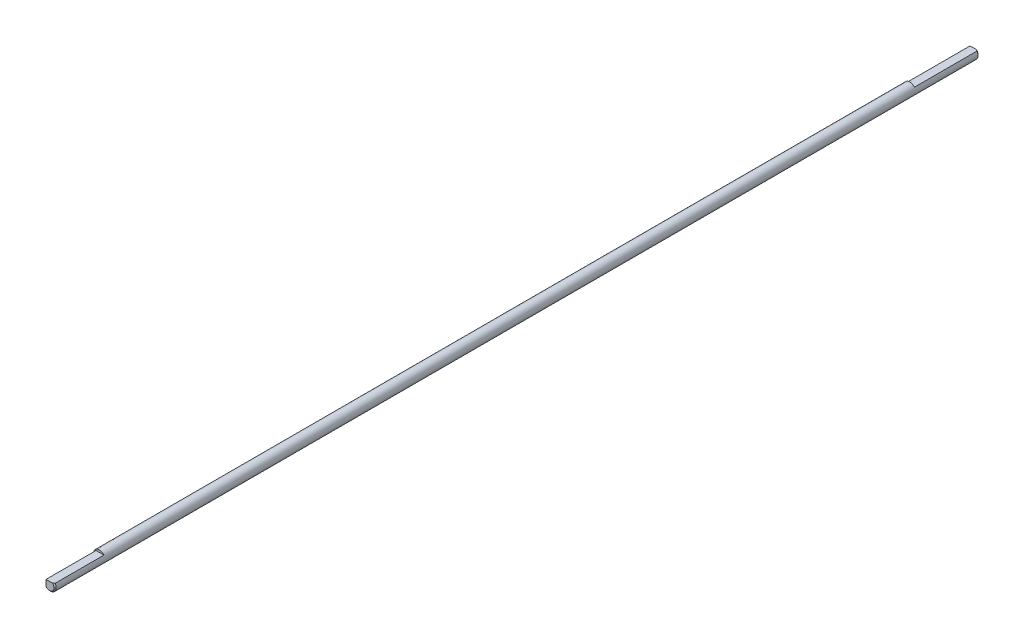
ISO-10303-21;
HEADER;
FILE_DESCRIPTION(('STEP AP214'),'2;1');
FILE_NAME('part.step','',(''),(''),'','','');
FILE_SCHEMA(('AUTOMOTIVE_DESIGN { 1 0 10303 214 1 1 1 1 }'));
ENDSEC;
DATA;
#1=APPLICATION_CONTEXT('core data for automotive mechanical design processes');
#2=APPLICATION_PROTOCOL_DEFINITION('international standard','automotive_design',2000,#1);
#3=PRODUCT_CONTEXT('',#1,'mechanical');
#4=PRODUCT('Part','Part','',(#3));
#5=PRODUCT_RELATED_PRODUCT_CATEGORY('part','',(#4));
#6=PRODUCT_DEFINITION_FORMATION('','',#4);
#7=PRODUCT_DEFINITION_CONTEXT('part definition',#1,'design');
#8=PRODUCT_DEFINITION('design','',#6,#7);
#9=PRODUCT_DEFINITION_SHAPE('','',#8);
#10=(LENGTH_UNIT() NAMED_UNIT(*) SI_UNIT(.MILLI.,.METRE.));
#11=(NAMED_UNIT(*) PLANE_ANGLE_UNIT() SI_UNIT($,.RADIAN.));
#12=(NAMED_UNIT(*) SI_UNIT($,.STERADIAN.) SOLID_ANGLE_UNIT());
#13=UNCERTAINTY_MEASURE_WITH_UNIT(LENGTH_MEASURE(1.E-05),#10,'distance_accuracy_value','');
#14=(GEOMETRIC_REPRESENTATION_CONTEXT(3) GLOBAL_UNCERTAINTY_ASSIGNED_CONTEXT((#13)) GLOBAL_UNIT_ASSIGNED_CONTEXT((#10,
#11,#12)) REPRESENTATION_CONTEXT('',''));
#15=CARTESIAN_POINT('',(0.,0.,0.));
#16=DIRECTION('',(0.,0.,1.));
#17=DIRECTION('',(1.,0.,0.));
#18=AXIS2_PLACEMENT_3D('',#15,#16,#17);
#19=CARTESIAN_POINT('',(0.,0.,406.5));
#20=DIRECTION('',(0.,0.,-1.));
#21=DIRECTION('',(-1.,0.,0.));
#22=AXIS2_PLACEMENT_3D('',#19,#20,#21);
#23=CONICAL_SURFACE('',#22,2.00000000000017,0.785398163397446);
#24=CARTESIAN_POINT('',(-1.49999999999998,-4.68458686901815,403.581122675511));
#25=CARTESIAN_POINT('',(-1.49999999999998,-4.5205549603687,403.737285618258));
#26=CARTESIAN_POINT('',(-1.49999999999998,-4.35619153924866,403.893106567315));
#27=CARTESIAN_POINT('',(-1.49999999999999,-4.0263543336501,404.2036875378));
#28=CARTESIAN_POINT('',(-1.49999999999999,-3.86088016984147,404.358447156035));
#29=CARTESIAN_POINT('',(-1.49999999999999,-3.52670292506329,404.668072794586));
#30=CARTESIAN_POINT('',(-1.49999999999999,-3.35798426076442,404.822922026419));
#31=CARTESIAN_POINT('',(-1.49999999999999,-3.01841889062168,405.130198012757));
#32=CARTESIAN_POINT('',(-1.49999999999999,-2.84757272912289,405.282625365101));
#33=CARTESIAN_POINT('',(-1.49999999999999,-2.551289051494,405.541039793886));
#34=CARTESIAN_POINT('',(-1.49999999999999,-2.42667470976102,405.647968763192));
#35=CARTESIAN_POINT('',(-1.49999999999999,-2.1748674216484,405.858927386102));
#36=CARTESIAN_POINT('',(-1.49999999999999,-2.04767302925744,405.962955331642));
#37=CARTESIAN_POINT('',(-1.49999999999999,-1.85422001809871,406.115344358516));
#38=CARTESIAN_POINT('',(-1.49999999999999,-1.78936214566972,406.165480755677));
#39=CARTESIAN_POINT('',(-1.49999999999999,-1.65848888675742,406.264215453266));
#40=CARTESIAN_POINT('',(-1.49999999999999,-1.59247359341393,406.312813876584));
#41=CARTESIAN_POINT('',(-1.49999999999999,-1.45905842997559,406.407951648873));
#42=CARTESIAN_POINT('',(-1.49999999999999,-1.39165985624326,406.454492807411));
#43=CARTESIAN_POINT('',(-1.5,-1.25507353512699,406.544857539658));
#44=CARTESIAN_POINT('',(-1.5,-1.18588629993052,406.588681879385));
#45=CARTESIAN_POINT('',(-1.5,-1.06280182200247,406.662131922002));
#46=CARTESIAN_POINT('',(-1.5,-1.0093936209319,406.692573315651));
#47=CARTESIAN_POINT('',(-1.5,-0.901094284115231,406.750747891768));
#48=CARTESIAN_POINT('',(-1.5,-0.846202863996252,406.778480550129));
#49=CARTESIAN_POINT('',(-1.5,-0.734902046694026,406.830370275776));
#50=CARTESIAN_POINT('',(-1.5,-0.678496718305271,406.854535975787));
#51=CARTESIAN_POINT('',(-1.5,-0.563954060641772,406.898360094126));
#52=CARTESIAN_POINT('',(-1.5,-0.505817526550659,406.91802054681));
#53=CARTESIAN_POINT('',(-1.5,-0.403557908017542,406.947216510329));
#54=CARTESIAN_POINT('',(-1.5,-0.359808018600364,406.958054401952));
#55=CARTESIAN_POINT('',(-1.5,-0.271590538929485,406.976221517714));
#56=CARTESIAN_POINT('',(-1.5,-0.227123217116098,406.983552024113));
#57=CARTESIAN_POINT('',(-1.5,-0.137813017886895,406.994333082547));
#58=CARTESIAN_POINT('',(-1.5,-0.0929711787577015,406.997792113725));
#59=CARTESIAN_POINT('',(-1.5,-0.00315598554007961,407.000668209425));
#60=CARTESIAN_POINT('',(-1.5,0.0418173679629544,407.000085291913));
#61=CARTESIAN_POINT('',(-1.5,0.131480696366007,406.99491350701));
#62=CARTESIAN_POINT('',(-1.5,0.176170924431829,406.990328957561));
#63=CARTESIAN_POINT('',(-1.5,0.265006653370637,406.977404950158));
#64=CARTESIAN_POINT('',(-1.5,0.3091520320494,406.969064665074));
#65=CARTESIAN_POINT('',(-1.5,0.396787338551471,406.948995950688));
#66=CARTESIAN_POINT('',(-1.5,0.440275064906677,406.937258025628));
#67=CARTESIAN_POINT('',(-1.5,0.526341606784407,406.910861933911));
#68=CARTESIAN_POINT('',(-1.5,0.568920440903614,406.896203827065));
#69=CARTESIAN_POINT('',(-1.5,0.718681140953554,406.839719922089));
#70=CARTESIAN_POINT('',(-1.5,0.823301569438845,406.791109001241));
#71=CARTESIAN_POINT('',(-1.5,1.0273760508116,406.683978577741));
#72=CARTESIAN_POINT('',(-1.5,1.12681709547903,406.625435563729));
#73=CARTESIAN_POINT('',(-1.5,1.32295189016529,406.501404509962));
#74=CARTESIAN_POINT('',(-1.5,1.41959636136016,406.435839435349));
#75=CARTESIAN_POINT('',(-1.50000000000001,1.60981707331443,406.300670711908));
#76=CARTESIAN_POINT('',(-1.50000000000001,1.70339655099179,406.231071553809));
#77=CARTESIAN_POINT('',(-1.50000000000001,1.89156846410963,406.086645899283));
#78=CARTESIAN_POINT('',(-1.50000000000001,1.98608570517427,406.011722001036));
#79=CARTESIAN_POINT('',(-1.50000000000001,2.17342430084887,405.859776903285));
#80=CARTESIAN_POINT('',(-1.50000000000001,2.26624549720138,405.782755509717));
#81=CARTESIAN_POINT('',(-1.50000000000001,2.45067491292482,405.627133743607));
#82=CARTESIAN_POINT('',(-1.50000000000001,2.54228212881375,405.548532185369));
#83=CARTESIAN_POINT('',(-1.50000000000001,2.72450804813486,405.390190823129));
#84=CARTESIAN_POINT('',(-1.50000000000001,2.81512673420913,405.310450999197));
#85=CARTESIAN_POINT('',(-1.50000000000001,2.99096207794877,405.1542094877));
#86=CARTESIAN_POINT('',(-1.50000000000001,3.07621751124202,405.077751366869));
#87=CARTESIAN_POINT('',(-1.50000000000001,3.24616595410877,404.924210859381));
#88=CARTESIAN_POINT('',(-1.50000000000001,3.33085895599087,404.847128464219));
#89=CARTESIAN_POINT('',(-1.50000000000001,3.49965693898566,404.692580160966));
#90=CARTESIAN_POINT('',(-1.50000000000001,3.58376261908279,404.615115015529));
#91=CARTESIAN_POINT('',(-1.50000000000001,3.75158905936748,404.459773991874));
#92=CARTESIAN_POINT('',(-1.50000000000001,3.83530983150905,404.381898126575));
#93=CARTESIAN_POINT('',(-1.50000000000001,3.91887732448951,404.30385897706));
#94=B_SPLINE_CURVE_WITH_KNOTS('',3,(#24,#25,#26,#27,#28,#29,#30,#31,#32,#33,#34,#35,#36,#37,#38,
#39,#40,#41,#42,#43,#44,#45,#46,#47,#48,#49,#50,#51,#52,#53,#54,#55,#56,#57,#58,#59,#60,#61,#62,
#63,#64,#65,#66,#67,#68,#69,#70,#71,#72,#73,#74,#75,#76,#77,#78,#79,#80,#81,#82,#83,#84,#85,#86,
#87,#88,#89,#90,#91,#92,#93),.UNSPECIFIED.,.F.,.F.,(4,2,2,2,2,2,2,2,2,2,2,2,2,2,2,2,2,2,2,2,2,2,
2,2,2,2,2,2,2,2,2,2,2,2,4),(0.,0.679447157806279,1.35913953364428,2.04614870262391,
2.73298556356831,3.22556921882086,3.71843702285229,3.96435101868385,4.21024531536907,
4.45591883535835,4.70152276877895,4.8858872059757,5.07028724516179,5.25423341378252,
5.43809635667747,5.57319055305011,5.70823532274111,5.84298374075929,5.97773155989749,
6.1123341595679,6.24696641741667,6.38197864112345,6.51698809971613,6.86206155213975,
7.20796356465453,7.55814960641624,7.90795304212564,8.26974460562593,8.6315697571543,
8.99367736880519,9.35579132862299,9.69934110948231,10.0428955788485,10.3859269431197,
10.7289475809715),.UNSPECIFIED.);
#95=CARTESIAN_POINT('',(-1.49999999999999,-2.,406.));
#96=VERTEX_POINT('',#95);
#97=CARTESIAN_POINT('',(-1.5,-1.32287565553255,406.5));
#98=VERTEX_POINT('',#97);
#99=EDGE_CURVE('E132',#96,#98,#94,.T.);
#100=ORIENTED_EDGE('',*,*,#99,.F.);
#101=CARTESIAN_POINT('',(0.,0.,406.));
#102=DIRECTION('',(0.,0.,1.));
#103=DIRECTION('',(1.,0.,0.));
#104=AXIS2_PLACEMENT_3D('',#101,#102,#103);
#105=CIRCLE('',#104,2.5);
#106=CARTESIAN_POINT('',(2.,1.5,406.));
#107=VERTEX_POINT('',#106);
#108=EDGE_CURVE('E131',#107,#96,#105,.F.);
#109=ORIENTED_EDGE('',*,*,#108,.F.);
#110=CARTESIAN_POINT('',(-5.30726101268403,1.5,402.984837313664));
#111=CARTESIAN_POINT('',(-5.19932456511571,1.5,403.088701790887));
#112=CARTESIAN_POINT('',(-5.0912742532426,1.5,403.192448133692));
#113=CARTESIAN_POINT('',(-4.87489153030666,1.5,403.39964811844));
#114=CARTESIAN_POINT('',(-4.76655911671054,1.5,403.503101757736));
#115=CARTESIAN_POINT('',(-4.44099087161315,1.5,403.81300204908));
#116=CARTESIAN_POINT('',(-4.22325282363592,1.5,404.018921742929));
#117=CARTESIAN_POINT('',(-3.78735533891748,1.5,404.42714091767));
#118=CARTESIAN_POINT('',(-3.5692104187413,1.5,404.629455824397));
#119=CARTESIAN_POINT('',(-3.2395911215118,1.5,404.930269929449));
#120=CARTESIAN_POINT('',(-3.12932498513125,1.5,405.030091820681));
#121=CARTESIAN_POINT('',(-2.90772671115968,1.5,405.228543837883));
#122=CARTESIAN_POINT('',(-2.79639459718391,1.5,405.327173990145));
#123=CARTESIAN_POINT('',(-2.60463800240204,1.5,405.494565864857));
#124=CARTESIAN_POINT('',(-2.52456708184748,1.5,405.56373218258));
#125=CARTESIAN_POINT('',(-2.36350815521976,1.5,405.701001518293));
#126=CARTESIAN_POINT('',(-2.28252009205182,1.5,405.76910446945));
#127=CARTESIAN_POINT('',(-2.11900885762458,1.5,405.904221424996));
#128=CARTESIAN_POINT('',(-2.03648033682405,1.5,405.971228975368));
#129=CARTESIAN_POINT('',(-1.86991949618727,1.5,406.103330977729));
#130=CARTESIAN_POINT('',(-1.78588740825402,1.5,406.168425720718));
#131=CARTESIAN_POINT('',(-1.61515674877159,1.5,406.296477693823));
#132=CARTESIAN_POINT('',(-1.52844234398337,1.5,406.359413945533));
#133=CARTESIAN_POINT('',(-1.3522307436927,1.5,406.481466265414));
#134=CARTESIAN_POINT('',(-1.26273142948422,1.5,406.540579314241));
#135=CARTESIAN_POINT('',(-1.08045990821698,1.5,406.652775745401));
#136=CARTESIAN_POINT('',(-0.987701593306496,1.5,406.705881416358));
#137=CARTESIAN_POINT('',(-0.797587111118589,1.5,406.803093560926));
#138=CARTESIAN_POINT('',(-0.700239501330549,1.5,406.847216026768));
#139=CARTESIAN_POINT('',(-0.549256702581115,1.5,406.903299439275));
#140=CARTESIAN_POINT('',(-0.497552868753914,1.5,406.920430591385));
#141=CARTESIAN_POINT('',(-0.392856035003627,1.5,406.950219952998));
#142=CARTESIAN_POINT('',(-0.33986324197814,1.5,406.962878875364));
#143=CARTESIAN_POINT('',(-0.233262595089835,1.5,406.982866221662));
#144=CARTESIAN_POINT('',(-0.179662042453671,1.5,406.990232836551));
#145=CARTESIAN_POINT('',(-0.0719778907168809,1.5,406.999231886282));
#146=CARTESIAN_POINT('',(-0.017894361232426,1.5,407.00086513457));
#147=CARTESIAN_POINT('',(0.0902887236831684,1.5,406.998261506888));
#148=CARTESIAN_POINT('',(0.144387849526196,1.5,406.994007179936));
#149=CARTESIAN_POINT('',(0.251852859397229,1.5,406.979938177855));
#150=CARTESIAN_POINT('',(0.305218588130625,1.5,406.970122343122));
#151=CARTESIAN_POINT('',(0.41121512988126,1.5,406.945517586031));
#152=CARTESIAN_POINT('',(0.463836768547663,1.5,406.930689873087));
#153=CARTESIAN_POINT('',(0.567720319582453,1.5,406.896911976505));
#154=CARTESIAN_POINT('',(0.618982157946676,1.5,406.877961569013));
#155=CARTESIAN_POINT('',(0.729371002356168,1.5,406.832968030558));
#156=CARTESIAN_POINT('',(0.788225074277425,1.5,406.806261628725));
#157=CARTESIAN_POINT('',(0.904194890537512,1.5,406.749281180969));
#158=CARTESIAN_POINT('',(0.961309640176746,1.5,406.71900514009));
#159=CARTESIAN_POINT('',(1.07410361365822,1.5,406.655680100544));
#160=CARTESIAN_POINT('',(1.12978006325883,1.5,406.622626200137));
#161=CARTESIAN_POINT('',(1.23983114213408,1.5,406.554409339303));
#162=CARTESIAN_POINT('',(1.2942055101691,1.5,406.519245960527));
#163=CARTESIAN_POINT('',(1.45683639069118,1.5,406.410555716495));
#164=CARTESIAN_POINT('',(1.5634130993015,1.5,406.334522151473));
#165=CARTESIAN_POINT('',(1.77330825811543,1.5,406.178417639994));
#166=CARTESIAN_POINT('',(1.87663056832282,1.5,406.098351793707));
#167=CARTESIAN_POINT('',(2.05477163041062,1.5,405.956381499756));
#168=CARTESIAN_POINT('',(2.13008914233534,1.5,405.895100008845));
#169=CARTESIAN_POINT('',(2.27974903531087,1.5,405.771357757993));
#170=CARTESIAN_POINT('',(2.35409139839699,1.5,405.708896976378));
#171=CARTESIAN_POINT('',(2.57598067842727,1.5,405.520136349109));
#172=CARTESIAN_POINT('',(2.72236841354634,1.5,405.392475517038));
#173=CARTESIAN_POINT('',(3.01325594843049,1.5,405.134705397271));
#174=CARTESIAN_POINT('',(3.15775340737695,1.5,405.004593485869));
#175=CARTESIAN_POINT('',(3.44529728175606,1.5,404.742801575043));
#176=CARTESIAN_POINT('',(3.5883438135755,1.5,404.611121703266));
#177=CARTESIAN_POINT('',(3.86368160911075,1.5,404.355655512292));
#178=CARTESIAN_POINT('',(3.99604140831614,1.5,404.231942902079));
#179=CARTESIAN_POINT('',(4.26007604237148,1.5,403.983782776201));
#180=CARTESIAN_POINT('',(4.39175085994569,1.5,403.859335242168));
#181=CARTESIAN_POINT('',(4.654306497464,1.5,403.610126802083));
#182=CARTESIAN_POINT('',(4.7851883748949,1.5,403.485367009112));
#183=CARTESIAN_POINT('',(5.04652082171565,1.5,403.235406087905));
#184=CARTESIAN_POINT('',(5.17697140695214,1.5,403.110204976242));
#185=CARTESIAN_POINT('',(5.30726101268403,1.5,402.984837313664));
#186=B_SPLINE_CURVE_WITH_KNOTS('',3,(#110,#111,#112,#113,#114,#115,#116,#117,#118,#119,#120,
#121,#122,#123,#124,#125,#126,#127,#128,#129,#130,#131,#132,#133,#134,#135,#136,#137,#138,#139,
#140,#141,#142,#143,#144,#145,#146,#147,#148,#149,#150,#151,#152,#153,#154,#155,#156,#157,#158,
#159,#160,#161,#162,#163,#164,#165,#166,#167,#168,#169,#170,#171,#172,#173,#174,#175,#176,#177,
#178,#179,#180,#181,#182,#183,#184,#185),.UNSPECIFIED.,.F.,.F.,(4,2,2,2,2,2,2,2,2,2,2,2,2,2,2,2,
2,2,2,2,2,2,2,2,2,2,2,2,2,2,2,2,2,2,2,2,2,4),(0.,0.449380704128739,0.898765457756984,
1.79782163899217,2.69035548350894,3.13656410743311,3.58276286900029,3.90017989442246,
4.21761678980323,4.5365145988044,4.8553636394198,5.17673455698211,5.49835625144817,
5.81874255164626,6.13855340271493,6.30179762746234,6.4650158197261,6.62704401271783,
6.78904921631627,6.95153563893402,7.11405595327458,7.27786408440033,7.44168111221185,
7.63540965895663,7.82924699211951,8.02343385171969,8.21765935047435,8.61022782846,
9.00231166681277,9.29359301557528,9.5848797229544,10.1675355940446,10.7508552540018,
11.3341277466587,11.8776457157972,12.4211773270514,12.9636295671867,13.5060616498617),.UNSPECIFIED.);
#187=CARTESIAN_POINT('',(1.32287565553255,1.5,406.5));
#188=VERTEX_POINT('',#187);
#189=EDGE_CURVE('E166',#188,#107,#186,.T.);
#190=ORIENTED_EDGE('',*,*,#189,.F.);
#191=CARTESIAN_POINT('',(0.,0.,406.5));
#192=DIRECTION('',(0.,0.,1.));
#193=DIRECTION('',(1.,0.,0.));
#194=AXIS2_PLACEMENT_3D('',#191,#192,#193);
#195=CIRCLE('',#194,2.00000000000017);
#196=EDGE_CURVE('E199',#98,#188,#195,.T.);
#197=ORIENTED_EDGE('',*,*,#196,.F.);
#198=EDGE_LOOP('',(#100,#109,#190,#197));
#199=FACE_BOUND('',#198,.T.);
#200=ADVANCED_FACE('F34',(#199),#23,.T.);
#201=CARTESIAN_POINT('',(0.,0.,0.500000000000278));
#202=DIRECTION('',(0.,0.,1.));
#203=DIRECTION('',(1.,0.,0.));
#204=AXIS2_PLACEMENT_3D('',#201,#202,#203);
#205=CONICAL_SURFACE('',#204,2.5,0.785398163397446);
#206=CARTESIAN_POINT('',(-1.50000000000001,3.91887732448958,2.19614102294014));
#207=CARTESIAN_POINT('',(-1.50000000000001,3.79813414856927,2.08340923063465));
#208=CARTESIAN_POINT('',(-1.50000000000001,3.67708781006377,1.97099735434282));
#209=CARTESIAN_POINT('',(-1.50000000000001,3.43409513403781,1.74709326427966));
#210=CARTESIAN_POINT('',(-1.50000000000001,3.31214858979545,1.63560127503781));
#211=CARTESIAN_POINT('',(-1.50000000000001,3.06621960504444,1.41305681509747));
#212=CARTESIAN_POINT('',(-1.50000000000001,2.94222879098329,1.30201357730782));
#213=CARTESIAN_POINT('',(-1.50000000000001,2.69267962066065,1.08173084132915));
#214=CARTESIAN_POINT('',(-1.50000000000001,2.56712148681517,0.97249109220683));
#215=CARTESIAN_POINT('',(-1.50000000000001,2.33814360187832,0.777418400416315));
#216=CARTESIAN_POINT('',(-1.50000000000001,2.23511503193289,0.691127738574186));
#217=CARTESIAN_POINT('',(-1.50000000000001,2.0270216640764,0.520955262047149));
#218=CARTESIAN_POINT('',(-1.50000000000001,1.92195622645604,0.437074225361877));
#219=CARTESIAN_POINT('',(-1.50000000000001,1.70921657676164,0.273065471083362));
#220=CARTESIAN_POINT('',(-1.50000000000001,1.60154749113932,0.19293116520274));
#221=CARTESIAN_POINT('',(-1.5,1.38229195003434,0.0382977176912095));
#222=CARTESIAN_POINT('',(-1.5,1.27070825813244,-0.0362052867327775));
#223=CARTESIAN_POINT('',(-1.5,1.05710054816558,-0.166618274389845));
#224=CARTESIAN_POINT('',(-1.5,0.955803081730183,-0.223681677192179));
#225=CARTESIAN_POINT('',(-1.5,0.799627740730314,-0.300770312773499));
#226=CARTESIAN_POINT('',(-1.5,0.74686862084762,-0.325047252979518));
#227=CARTESIAN_POINT('',(-1.5,0.639841883921888,-0.369961668282664));
#228=CARTESIAN_POINT('',(-1.5,0.585574651087581,-0.390600060677541));
#229=CARTESIAN_POINT('',(-1.5,0.44299195450491,-0.438114218179931));
#230=CARTESIAN_POINT('',(-1.5,0.353427095529281,-0.461516874115339));
#231=CARTESIAN_POINT('',(-1.5,0.217264822733596,-0.485008869594317));
#232=CARTESIAN_POINT('',(-1.5,0.171639160156375,-0.490904036202391));
#233=CARTESIAN_POINT('',(-1.5,0.0800315902036498,-0.498558110545023));
#234=CARTESIAN_POINT('',(-1.5,0.0340497033464576,-0.500317254760826));
#235=CARTESIAN_POINT('',(-1.5,-0.0580063289513867,-0.499587097580963));
#236=CARTESIAN_POINT('',(-1.5,-0.104080374062826,-0.497085934434107));
#237=CARTESIAN_POINT('',(-1.5,-0.195820133077827,-0.487961277591059));
#238=CARTESIAN_POINT('',(-1.5,-0.241485771664848,-0.481337038812869));
#239=CARTESIAN_POINT('',(-1.5,-0.332243569003219,-0.46429472491976));
#240=CARTESIAN_POINT('',(-1.5,-0.377333448663572,-0.453864680040605));
#241=CARTESIAN_POINT('',(-1.5,-0.466604077730065,-0.429690141854051));
#242=CARTESIAN_POINT('',(-1.5,-0.510784771814424,-0.415945447501512));
#243=CARTESIAN_POINT('',(-1.5,-0.651421778930529,-0.367190990493306));
#244=CARTESIAN_POINT('',(-1.5,-0.745970631953605,-0.32667891619403));
#245=CARTESIAN_POINT('',(-1.5,-0.930665701126438,-0.236591636010479));
#246=CARTESIAN_POINT('',(-1.5,-1.02080267603189,-0.186998358375615));
#247=CARTESIAN_POINT('',(-1.5,-1.1987746323542,-0.0811759668390184));
#248=CARTESIAN_POINT('',(-1.5,-1.28655909094382,-0.0248629910849656));
#249=CARTESIAN_POINT('',(-1.49999999999999,-1.45927664547077,0.0917554012456434));
#250=CARTESIAN_POINT('',(-1.49999999999999,-1.54421233099419,0.152057035194133));
#251=CARTESIAN_POINT('',(-1.49999999999999,-1.69981673345074,0.266500780461889));
#252=CARTESIAN_POINT('',(-1.49999999999999,-1.77076544725953,0.320264969130735));
#253=CARTESIAN_POINT('',(-1.49999999999999,-1.91146228705308,0.429345655703136));
#254=CARTESIAN_POINT('',(-1.49999999999999,-1.98121033736181,0.484662250878798));
#255=CARTESIAN_POINT('',(-1.49999999999999,-2.18906635103304,0.652407098429513));
#256=CARTESIAN_POINT('',(-1.49999999999999,-2.32574679416352,0.766600780945726));
#257=CARTESIAN_POINT('',(-1.49999999999999,-2.59682343078268,0.998093294492054));
#258=CARTESIAN_POINT('',(-1.49999999999999,-2.73121542156688,1.11539699942102));
#259=CARTESIAN_POINT('',(-1.49999999999999,-2.99823311259031,1.35195025457724));
#260=CARTESIAN_POINT('',(-1.49999999999999,-3.13085909823167,1.4711994832854));
#261=CARTESIAN_POINT('',(-1.49999999999999,-3.38303476185824,1.70032660305557));
#262=CARTESIAN_POINT('',(-1.49999999999999,-3.50269150833795,1.81008700933454));
#263=CARTESIAN_POINT('',(-1.49999999999999,-3.74122184580356,2.03046658602853));
#264=CARTESIAN_POINT('',(-1.49999999999999,-3.86009539779347,2.14108579861582));
#265=CARTESIAN_POINT('',(-1.49999999999999,-4.09684829269998,2.3626165072258));
#266=CARTESIAN_POINT('',(-1.49999999999998,-4.21472960840878,2.47352589752559));
#267=CARTESIAN_POINT('',(-1.49999999999998,-4.44999737034063,2.69585214078277));
#268=CARTESIAN_POINT('',(-1.49999999999998,-4.5673838504373,2.80726895788162));
#269=CARTESIAN_POINT('',(-1.49999999999998,-4.6845868690182,2.91887732448986));
#270=B_SPLINE_CURVE_WITH_KNOTS('',3,(#206,#207,#208,#209,#210,#211,#212,#213,#214,#215,#216,
#217,#218,#219,#220,#221,#222,#223,#224,#225,#226,#227,#228,#229,#230,#231,#232,#233,#234,#235,
#236,#237,#238,#239,#240,#241,#242,#243,#244,#245,#246,#247,#248,#249,#250,#251,#252,#253,#254,
#255,#256,#257,#258,#259,#260,#261,#262,#263,#264,#265,#266,#267,#268,#269),.UNSPECIFIED.,.F.,
.F.,(4,2,2,2,2,2,2,2,2,2,2,2,2,2,2,2,2,2,2,2,2,2,2,2,2,2,2,2,2,2,2,4),(0.,0.495571091978249,
0.99125976439574,1.49058682626759,1.98984381722424,2.39299181332244,2.79626854393329,
3.19880720526701,3.60106719086488,3.94934629857888,4.12345930261591,4.29752834885007,
4.57399905216004,4.71185414859683,4.84970136283795,4.98793300553556,5.12618963536229,
5.26488490239687,5.40358858390357,5.7113236286709,6.01967786153901,6.33238908822692,
6.64480789438,6.91183753332145,7.17888394157293,7.71312452224757,8.24825861381134,
8.7833051468755,9.27042021908047,9.75755936462768,10.2431213921719,10.7286496228492),.UNSPECIFIED.);
#271=CARTESIAN_POINT('',(-1.5,1.5,0.121320343559922));
#272=VERTEX_POINT('',#271);
#273=CARTESIAN_POINT('',(-1.5,1.32287565553215,0.));
#274=VERTEX_POINT('',#273);
#275=EDGE_CURVE('E134',#272,#274,#270,.T.);
#276=ORIENTED_EDGE('',*,*,#275,.F.);
#277=CARTESIAN_POINT('',(5.30726101268403,1.5,3.51516268633656));
#278=CARTESIAN_POINT('',(5.19932456511572,1.5,3.41129820911317));
#279=CARTESIAN_POINT('',(5.09127425324259,1.5,3.30755186630791));
#280=CARTESIAN_POINT('',(4.87489153030663,1.5,3.10035188156075));
#281=CARTESIAN_POINT('',(4.76655911671051,1.5,2.99689824226489));
#282=CARTESIAN_POINT('',(4.44099087161311,1.5,2.68699795092012));
#283=CARTESIAN_POINT('',(4.22325282363589,1.5,2.4810782570709));
#284=CARTESIAN_POINT('',(3.78735533891746,1.5,2.07285908232997));
#285=CARTESIAN_POINT('',(3.56921041874128,1.5,1.87054417560366));
#286=CARTESIAN_POINT('',(3.23959112151179,1.5,1.56973007055138));
#287=CARTESIAN_POINT('',(3.12932498513124,1.5,1.46990817931948));
#288=CARTESIAN_POINT('',(2.90772671115969,1.5,1.27145616211752));
#289=CARTESIAN_POINT('',(2.79639459718392,1.5,1.17282600985514));
#290=CARTESIAN_POINT('',(2.60463800240206,1.5,1.00543413514343));
#291=CARTESIAN_POINT('',(2.52456708184751,1.5,0.936267817420279));
#292=CARTESIAN_POINT('',(2.36350815521982,1.5,0.798998481707581));
#293=CARTESIAN_POINT('',(2.28252009205189,1.5,0.730895530550476));
#294=CARTESIAN_POINT('',(2.11900885762465,1.5,0.595778575004049));
#295=CARTESIAN_POINT('',(2.03648033682411,1.5,0.528771024632671));
#296=CARTESIAN_POINT('',(1.86991949618731,1.5,0.396669022271575));
#297=CARTESIAN_POINT('',(1.78588740825404,1.5,0.33157427928276));
#298=CARTESIAN_POINT('',(1.6151567487716,1.5,0.203522306177848));
#299=CARTESIAN_POINT('',(1.52844234398338,1.5,0.140586054467893));
#300=CARTESIAN_POINT('',(1.3522307436927,1.5,0.0185337345862325));
#301=CARTESIAN_POINT('',(1.26273142948421,1.5,-0.0405793142401074));
#302=CARTESIAN_POINT('',(1.08045990821697,1.5,-0.152775745400276));
#303=CARTESIAN_POINT('',(0.987701593306506,1.5,-0.205881416357677));
#304=CARTESIAN_POINT('',(0.797587111118615,1.5,-0.303093560925812));
#305=CARTESIAN_POINT('',(0.700239501330569,1.5,-0.347216026767928));
#306=CARTESIAN_POINT('',(0.549256702581138,1.5,-0.403299439274848));
#307=CARTESIAN_POINT('',(0.497552868753941,1.5,-0.420430591384574));
#308=CARTESIAN_POINT('',(0.392856035003656,1.5,-0.450219952997762));
#309=CARTESIAN_POINT('',(0.339863241978166,1.5,-0.46287887536373));
#310=CARTESIAN_POINT('',(0.233262595089859,1.5,-0.482866221661123));
#311=CARTESIAN_POINT('',(0.179662042453694,1.5,-0.490232836550451));
#312=CARTESIAN_POINT('',(0.0719778907169046,1.5,-0.499231886281139));
#313=CARTESIAN_POINT('',(0.0178943612324492,1.5,-0.500865134569152));
#314=CARTESIAN_POINT('',(-0.0902887236831515,1.5,-0.498261506887964));
#315=CARTESIAN_POINT('',(-0.144387849526184,1.5,-0.49400717993598));
#316=CARTESIAN_POINT('',(-0.25185285939722,1.5,-0.479938177854234));
#317=CARTESIAN_POINT('',(-0.305218588130612,1.5,-0.47012234312171));
#318=CARTESIAN_POINT('',(-0.411215129881248,1.5,-0.445517586030134));
#319=CARTESIAN_POINT('',(-0.463836768547656,1.5,-0.430689873086443));
#320=CARTESIAN_POINT('',(-0.567720319582447,1.5,-0.396911976504635));
#321=CARTESIAN_POINT('',(-0.618982157946665,1.5,-0.377961569012174));
#322=CARTESIAN_POINT('',(-0.729371002356146,1.5,-0.332968030557588));
#323=CARTESIAN_POINT('',(-0.788225074277397,1.5,-0.306261628724453));
#324=CARTESIAN_POINT('',(-0.90419489053748,1.5,-0.249281180968204));
#325=CARTESIAN_POINT('',(-0.961309640176717,1.5,-0.219005140089837));
#326=CARTESIAN_POINT('',(-1.0741036136582,1.5,-0.15568010054384));
#327=CARTESIAN_POINT('',(-1.12978006325881,1.5,-0.122626200136503));
#328=CARTESIAN_POINT('',(-1.23983114213405,1.5,-0.0544093393029018));
#329=CARTESIAN_POINT('',(-1.29420551016907,1.5,-0.0192459605261648));
#330=CARTESIAN_POINT('',(-1.45683639069114,1.5,0.0894442835054712));
#331=CARTESIAN_POINT('',(-1.56341309930146,1.5,0.165477848527196));
#332=CARTESIAN_POINT('',(-1.77330825811539,1.5,0.321582360006658));
#333=CARTESIAN_POINT('',(-1.87663056832278,1.5,0.401648206293571));
#334=CARTESIAN_POINT('',(-2.05477163041058,1.5,0.543618500244207));
#335=CARTESIAN_POINT('',(-2.1300891423353,1.5,0.604899991155266));
#336=CARTESIAN_POINT('',(-2.27974903531083,1.5,0.728642242007426));
#337=CARTESIAN_POINT('',(-2.35409139839697,1.5,0.791103023622449));
#338=CARTESIAN_POINT('',(-2.57598067842726,1.5,0.979863650891184));
#339=CARTESIAN_POINT('',(-2.72236841354633,1.5,1.10752448296215));
#340=CARTESIAN_POINT('',(-3.01325594843048,1.5,1.36529460272912));
#341=CARTESIAN_POINT('',(-3.15775340737696,1.5,1.49540651413161));
#342=CARTESIAN_POINT('',(-3.44529728175609,1.5,1.75719842495768));
#343=CARTESIAN_POINT('',(-3.58834381357553,1.5,1.88887829673474));
#344=CARTESIAN_POINT('',(-3.86368160911078,1.5,2.14434448770829));
#345=CARTESIAN_POINT('',(-3.99604140831616,1.5,2.2680570979211));
#346=CARTESIAN_POINT('',(-4.26007604237149,1.5,2.51621722379944));
#347=CARTESIAN_POINT('',(-4.3917508599457,1.5,2.6406647578329));
#348=CARTESIAN_POINT('',(-4.65430649746401,1.5,2.88987319791696));
#349=CARTESIAN_POINT('',(-4.7851883748949,1.5,3.01463299088809));
#350=CARTESIAN_POINT('',(-5.04652082171565,1.5,3.26459391209505));
#351=CARTESIAN_POINT('',(-5.17697140695214,1.5,3.38979502375864));
#352=CARTESIAN_POINT('',(-5.30726101268403,1.5,3.51516268633656));
#353=B_SPLINE_CURVE_WITH_KNOTS('',3,(#277,#278,#279,#280,#281,#282,#283,#284,#285,#286,#287,
#288,#289,#290,#291,#292,#293,#294,#295,#296,#297,#298,#299,#300,#301,#302,#303,#304,#305,#306,
#307,#308,#309,#310,#311,#312,#313,#314,#315,#316,#317,#318,#319,#320,#321,#322,#323,#324,#325,
#326,#327,#328,#329,#330,#331,#332,#333,#334,#335,#336,#337,#338,#339,#340,#341,#342,#343,#344,
#345,#346,#347,#348,#349,#350,#351,#352),.UNSPECIFIED.,.F.,.F.,(4,2,2,2,2,2,2,2,2,2,2,2,2,2,2,2,
2,2,2,2,2,2,2,2,2,2,2,2,2,2,2,2,2,2,2,2,2,4),(0.,0.449380704128809,0.898765457757006,
1.79782163899222,2.69035548350896,3.13656410743311,3.58276286900028,3.90017989442239,
4.21761678980314,4.53651459880434,4.85536363941976,5.17673455698211,5.49835625144818,
5.81874255164624,6.13855340271491,6.30179762746232,6.46501581972608,6.62704401271781,
6.78904921631625,6.95153563893401,7.11405595327458,7.27786408440032,7.44168111221184,
7.6354096589566,7.82924699211946,8.02343385171966,8.21765935047432,8.61022782845997,
9.00231166681272,9.29359301557526,9.58487972295435,10.1675355940446,10.7508552540018,
11.3341277466588,11.8776457157972,12.4211773270514,12.9636295671867,13.5060616498617),.UNSPECIFIED.);
#354=CARTESIAN_POINT('',(-1.32287565553188,1.5,0.));
#355=VERTEX_POINT('',#354);
#356=EDGE_CURVE('E210',#355,#272,#353,.T.);
#357=ORIENTED_EDGE('',*,*,#356,.F.);
#358=CARTESIAN_POINT('',(0.,0.,0.));
#359=DIRECTION('',(0.,0.,1.));
#360=DIRECTION('',(1.,0.,0.));
#361=AXIS2_PLACEMENT_3D('',#358,#359,#360);
#362=CIRCLE('',#361,1.99999999999972);
#363=EDGE_CURVE('E207',#274,#355,#362,.F.);
#364=ORIENTED_EDGE('',*,*,#363,.F.);
#365=EDGE_LOOP('',(#276,#357,#364));
#366=FACE_BOUND('',#365,.T.);
#367=ADVANCED_FACE('F242',(#366),#205,.T.);
#368=CARTESIAN_POINT('',(0.,0.,406.5));
#369=DIRECTION('',(0.,0.,-1.));
#370=DIRECTION('',(-1.,0.,0.));
#371=AXIS2_PLACEMENT_3D('',#368,#369,#370);
#372=CYLINDRICAL_SURFACE('',#371,2.5);
#373=ORIENTED_EDGE('',*,*,#108,.T.);
#374=DIRECTION('',(0.,0.,-1.));
#375=VECTOR('',#374,1.);
#376=CARTESIAN_POINT('',(-1.49999999999999,-2.,406.5));
#377=LINE('',#376,#375);
#378=CARTESIAN_POINT('',(-1.49999999999999,-2.,384.5));
#379=VERTEX_POINT('',#378);
#380=EDGE_CURVE('E123',#96,#379,#377,.T.);
#381=ORIENTED_EDGE('',*,*,#380,.T.);
#382=CARTESIAN_POINT('',(0.,0.,384.5));
#383=DIRECTION('',(0.,0.,-1.));
#384=DIRECTION('',(-1.,0.,0.));
#385=AXIS2_PLACEMENT_3D('',#382,#383,#384);
#386=CIRCLE('',#385,2.5);
#387=CARTESIAN_POINT('',(2.,1.5,384.5));
#388=VERTEX_POINT('',#387);
#389=EDGE_CURVE('E111',#379,#388,#386,.T.);
#390=ORIENTED_EDGE('',*,*,#389,.T.);
#391=DIRECTION('',(0.,0.,-1.));
#392=VECTOR('',#391,1.);
#393=CARTESIAN_POINT('',(2.,1.5,406.5));
#394=LINE('',#393,#392);
#395=EDGE_CURVE('E234',#388,#107,#394,.F.);
#396=ORIENTED_EDGE('',*,*,#395,.T.);
#397=EDGE_LOOP('',(#373,#381,#390,#396));
#398=FACE_BOUND('',#397,.T.);
#399=CARTESIAN_POINT('',(0.,0.,28.));
#400=DIRECTION('',(0.,0.,1.));
#401=DIRECTION('',(1.,0.,0.));
#402=AXIS2_PLACEMENT_3D('',#399,#400,#401);
#403=CIRCLE('',#402,2.5);
#404=CARTESIAN_POINT('',(2.,1.5,28.));
#405=VERTEX_POINT('',#404);
#406=CARTESIAN_POINT('',(-1.49999999999999,-2.,28.));
#407=VERTEX_POINT('',#406);
#408=EDGE_CURVE('E172',#405,#407,#403,.T.);
#409=ORIENTED_EDGE('',*,*,#408,.T.);
#410=DIRECTION('',(0.,0.,-1.));
#411=VECTOR('',#410,1.);
#412=CARTESIAN_POINT('',(-1.49999999999999,-2.,406.5));
#413=LINE('',#412,#411);
#414=CARTESIAN_POINT('',(-1.49999999999999,-2.,0.500000000000278));
#415=VERTEX_POINT('',#414);
#416=EDGE_CURVE('E226',#407,#415,#413,.T.);
#417=ORIENTED_EDGE('',*,*,#416,.T.);
#418=CARTESIAN_POINT('',(0.,0.,0.500000000000278));
#419=DIRECTION('',(0.,0.,1.));
#420=DIRECTION('',(1.,0.,0.));
#421=AXIS2_PLACEMENT_3D('',#418,#419,#420);
#422=CIRCLE('',#421,2.5);
#423=CARTESIAN_POINT('',(2.00000000000024,1.5,0.500000000000377));
#424=VERTEX_POINT('',#423);
#425=EDGE_CURVE('E198',#415,#424,#422,.T.);
#426=ORIENTED_EDGE('',*,*,#425,.T.);
#427=DIRECTION('',(0.,0.,-1.));
#428=VECTOR('',#427,1.);
#429=CARTESIAN_POINT('',(2.,1.5,406.5));
#430=LINE('',#429,#428);
#431=EDGE_CURVE('E202',#424,#405,#430,.F.);
#432=ORIENTED_EDGE('',*,*,#431,.T.);
#433=EDGE_LOOP('',(#409,#417,#426,#432));
#434=FACE_BOUND('',#433,.T.);
#435=ADVANCED_FACE('F128',(#398,#434),#372,.T.);
#436=CARTESIAN_POINT('',(0.,0.,406.5));
#437=DIRECTION('',(0.,0.,1.));
#438=DIRECTION('',(1.,0.,0.));
#439=AXIS2_PLACEMENT_3D('',#436,#437,#438);
#440=PLANE('',#439);
#441=DIRECTION('',(0.,1.,0.));
#442=VECTOR('',#441,1.);
#443=CARTESIAN_POINT('',(-1.5,0.,406.5));
#444=LINE('',#443,#442);
#445=CARTESIAN_POINT('',(-1.5,1.32287565553254,406.5));
#446=VERTEX_POINT('',#445);
#447=EDGE_CURVE('E136',#98,#446,#444,.T.);
#448=ORIENTED_EDGE('',*,*,#447,.F.);
#449=ORIENTED_EDGE('',*,*,#196,.T.);
#450=DIRECTION('',(1.,0.,0.));
#451=VECTOR('',#450,1.);
#452=CARTESIAN_POINT('',(0.,1.5,406.5));
#453=LINE('',#452,#451);
#454=CARTESIAN_POINT('',(-1.32287565553255,1.5,406.5));
#455=VERTEX_POINT('',#454);
#456=EDGE_CURVE('E197',#455,#188,#453,.T.);
#457=ORIENTED_EDGE('',*,*,#456,.F.);
#458=EDGE_CURVE('E193',#455,#446,#195,.T.);
#459=ORIENTED_EDGE('',*,*,#458,.T.);
#460=EDGE_LOOP('',(#448,#449,#457,#459));
#461=FACE_BOUND('',#460,.T.);
#462=ADVANCED_FACE('F195',(#461),#440,.T.);
#463=CARTESIAN_POINT('',(0.,0.,0.));
#464=DIRECTION('',(0.,0.,1.));
#465=DIRECTION('',(1.,0.,0.));
#466=AXIS2_PLACEMENT_3D('',#463,#464,#465);
#467=PLANE('',#466);
#468=CARTESIAN_POINT('',(1.32287565553188,1.5,0.));
#469=VERTEX_POINT('',#468);
#470=CARTESIAN_POINT('',(-1.5,-1.32287565553188,0.));
#471=VERTEX_POINT('',#470);
#472=EDGE_CURVE('E208',#469,#471,#362,.F.);
#473=ORIENTED_EDGE('',*,*,#472,.T.);
#474=DIRECTION('',(0.,1.,0.));
#475=VECTOR('',#474,1.);
#476=CARTESIAN_POINT('',(-1.5,0.,0.));
#477=LINE('',#476,#475);
#478=EDGE_CURVE('E146',#471,#274,#477,.T.);
#479=ORIENTED_EDGE('',*,*,#478,.T.);
#480=ORIENTED_EDGE('',*,*,#363,.T.);
#481=DIRECTION('',(1.,0.,0.));
#482=VECTOR('',#481,1.);
#483=CARTESIAN_POINT('',(0.,1.5,0.));
#484=LINE('',#483,#482);
#485=EDGE_CURVE('E233',#355,#469,#484,.T.);
#486=ORIENTED_EDGE('',*,*,#485,.T.);
#487=EDGE_LOOP('',(#473,#479,#480,#486));
#488=FACE_BOUND('',#487,.T.);
#489=ADVANCED_FACE('F178',(#488),#467,.F.);
#490=CARTESIAN_POINT('',(-1.5,1.5,406.37867965644));
#491=VERTEX_POINT('',#490);
#492=EDGE_CURVE('E125',#446,#491,#94,.T.);
#493=ORIENTED_EDGE('',*,*,#492,.F.);
#494=ORIENTED_EDGE('',*,*,#458,.F.);
#495=EDGE_CURVE('E119',#491,#455,#186,.T.);
#496=ORIENTED_EDGE('',*,*,#495,.F.);
#497=EDGE_LOOP('',(#493,#494,#496));
#498=FACE_BOUND('',#497,.T.);
#499=ADVANCED_FACE('F174',(#498),#23,.T.);
#500=EDGE_CURVE('E147',#471,#415,#270,.T.);
#501=ORIENTED_EDGE('',*,*,#500,.F.);
#502=ORIENTED_EDGE('',*,*,#472,.F.);
#503=EDGE_CURVE('E216',#424,#469,#353,.T.);
#504=ORIENTED_EDGE('',*,*,#503,.F.);
#505=ORIENTED_EDGE('',*,*,#425,.F.);
#506=EDGE_LOOP('',(#501,#502,#504,#505));
#507=FACE_BOUND('',#506,.T.);
#508=ADVANCED_FACE('F36',(#507),#205,.T.);
#509=CARTESIAN_POINT('',(-2.5,4.00986962003138,28.));
#510=DIRECTION('',(0.,0.,1.));
#511=DIRECTION('',(1.,0.,0.));
#512=AXIS2_PLACEMENT_3D('',#509,#510,#511);
#513=PLANE('',#512);
#514=DIRECTION('',(1.,0.,0.));
#515=VECTOR('',#514,1.);
#516=CARTESIAN_POINT('',(-2.5,1.5,28.));
#517=LINE('',#516,#515);
#518=CARTESIAN_POINT('',(-1.5,1.5,28.));
#519=VERTEX_POINT('',#518);
#520=EDGE_CURVE('E232',#519,#405,#517,.T.);
#521=ORIENTED_EDGE('',*,*,#520,.F.);
#522=DIRECTION('',(0.,1.,0.));
#523=VECTOR('',#522,1.);
#524=CARTESIAN_POINT('',(-1.49999999999999,-2.50000000000001,28.));
#525=LINE('',#524,#523);
#526=EDGE_CURVE('E58',#407,#519,#525,.T.);
#527=ORIENTED_EDGE('',*,*,#526,.F.);
#528=ORIENTED_EDGE('',*,*,#408,.F.);
#529=EDGE_LOOP('',(#521,#527,#528));
#530=FACE_BOUND('',#529,.T.);
#531=ADVANCED_FACE('F231',(#530),#513,.F.);
#532=CARTESIAN_POINT('',(-2.5,1.5,28.));
#533=DIRECTION('',(0.,-1.,0.));
#534=DIRECTION('',(0.,0.,-1.));
#535=AXIS2_PLACEMENT_3D('',#532,#533,#534);
#536=PLANE('',#535);
#537=ORIENTED_EDGE('',*,*,#356,.T.);
#538=DIRECTION('',(0.,0.,1.));
#539=VECTOR('',#538,1.);
#540=CARTESIAN_POINT('',(-1.5,1.5,28.));
#541=LINE('',#540,#539);
#542=EDGE_CURVE('E43',#272,#519,#541,.T.);
#543=ORIENTED_EDGE('',*,*,#542,.T.);
#544=ORIENTED_EDGE('',*,*,#520,.T.);
#545=ORIENTED_EDGE('',*,*,#431,.F.);
#546=ORIENTED_EDGE('',*,*,#503,.T.);
#547=ORIENTED_EDGE('',*,*,#485,.F.);
#548=EDGE_LOOP('',(#537,#543,#544,#545,#546,#547));
#549=FACE_BOUND('',#548,.T.);
#550=ADVANCED_FACE('F158',(#549),#536,.F.);
#551=CARTESIAN_POINT('',(-2.5,3.44214643811879,384.5));
#552=DIRECTION('',(0.,0.,-1.));
#553=DIRECTION('',(-1.,0.,0.));
#554=AXIS2_PLACEMENT_3D('',#551,#552,#553);
#555=PLANE('',#554);
#556=DIRECTION('',(1.,0.,0.));
#557=VECTOR('',#556,1.);
#558=CARTESIAN_POINT('',(-2.5,1.5,384.5));
#559=LINE('',#558,#557);
#560=CARTESIAN_POINT('',(-1.49999999999999,1.5,384.5));
#561=VERTEX_POINT('',#560);
#562=EDGE_CURVE('E114',#561,#388,#559,.T.);
#563=ORIENTED_EDGE('',*,*,#562,.T.);
#564=ORIENTED_EDGE('',*,*,#389,.F.);
#565=DIRECTION('',(0.,1.,0.));
#566=VECTOR('',#565,1.);
#567=CARTESIAN_POINT('',(-1.49999999999999,-2.50000000000001,384.5));
#568=LINE('',#567,#566);
#569=EDGE_CURVE('E50',#379,#561,#568,.T.);
#570=ORIENTED_EDGE('',*,*,#569,.T.);
#571=EDGE_LOOP('',(#563,#564,#570));
#572=FACE_BOUND('',#571,.T.);
#573=ADVANCED_FACE('F112',(#572),#555,.F.);
#574=CARTESIAN_POINT('',(-2.5,1.5,412.5));
#575=DIRECTION('',(0.,-1.,0.));
#576=DIRECTION('',(0.,0.,-1.));
#577=AXIS2_PLACEMENT_3D('',#574,#575,#576);
#578=PLANE('',#577);
#579=ORIENTED_EDGE('',*,*,#562,.F.);
#580=DIRECTION('',(0.,0.,1.));
#581=VECTOR('',#580,1.);
#582=CARTESIAN_POINT('',(-1.5,1.5,412.5));
#583=LINE('',#582,#581);
#584=EDGE_CURVE('E11',#561,#491,#583,.T.);
#585=ORIENTED_EDGE('',*,*,#584,.T.);
#586=ORIENTED_EDGE('',*,*,#495,.T.);
#587=ORIENTED_EDGE('',*,*,#456,.T.);
#588=ORIENTED_EDGE('',*,*,#189,.T.);
#589=ORIENTED_EDGE('',*,*,#395,.F.);
#590=EDGE_LOOP('',(#579,#585,#586,#587,#588,#589));
#591=FACE_BOUND('',#590,.T.);
#592=ADVANCED_FACE('F154',(#591),#578,.F.);
#593=CARTESIAN_POINT('',(-1.49999999999999,-2.50000000000001,28.));
#594=DIRECTION('',(1.,0.,0.));
#595=DIRECTION('',(0.,1.,0.));
#596=AXIS2_PLACEMENT_3D('',#593,#594,#595);
#597=PLANE('',#596);
#598=ORIENTED_EDGE('',*,*,#526,.T.);
#599=ORIENTED_EDGE('',*,*,#542,.F.);
#600=ORIENTED_EDGE('',*,*,#275,.T.);
#601=ORIENTED_EDGE('',*,*,#478,.F.);
#602=ORIENTED_EDGE('',*,*,#500,.T.);
#603=ORIENTED_EDGE('',*,*,#416,.F.);
#604=EDGE_LOOP('',(#598,#599,#600,#601,#602,#603));
#605=FACE_BOUND('',#604,.T.);
#606=ADVANCED_FACE('F149',(#605),#597,.F.);
#607=CARTESIAN_POINT('',(-1.49999999999999,-2.50000000000001,412.5));
#608=DIRECTION('',(1.,0.,0.));
#609=DIRECTION('',(0.,1.,0.));
#610=AXIS2_PLACEMENT_3D('',#607,#608,#609);
#611=PLANE('',#610);
#612=ORIENTED_EDGE('',*,*,#99,.T.);
#613=ORIENTED_EDGE('',*,*,#447,.T.);
#614=ORIENTED_EDGE('',*,*,#492,.T.);
#615=ORIENTED_EDGE('',*,*,#584,.F.);
#616=ORIENTED_EDGE('',*,*,#569,.F.);
#617=ORIENTED_EDGE('',*,*,#380,.F.);
#618=EDGE_LOOP('',(#612,#613,#614,#615,#616,#617));
#619=FACE_BOUND('',#618,.T.);
#620=ADVANCED_FACE('F122',(#619),#611,.F.);
#621=CLOSED_SHELL('',(#200,#367,#435,#462,#489,#499,#508,#531,#550,#573,#592,#606,#620));
#622=MANIFOLD_SOLID_BREP('B2',#621);
#623=ADVANCED_BREP_SHAPE_REPRESENTATION('',(#18,#622),#14);
#624=SHAPE_DEFINITION_REPRESENTATION(#9,#623);
ENDSEC;
END-ISO-10303-21;
